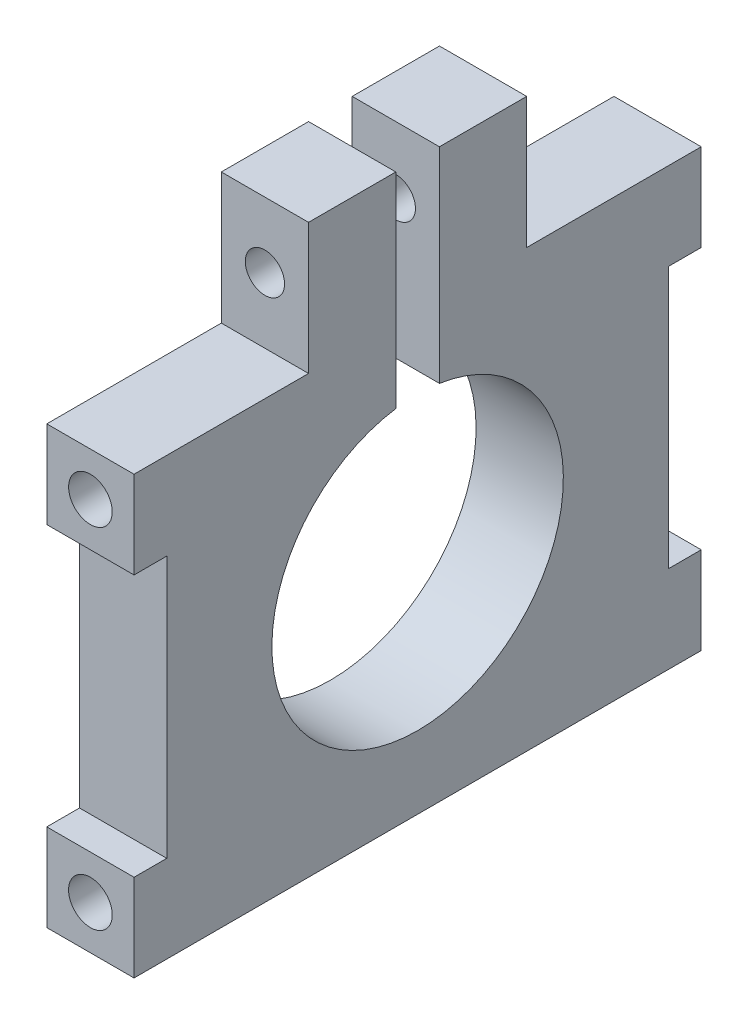
ISO-10303-21;
HEADER;
FILE_DESCRIPTION(('STEP AP214'),'2;1');
FILE_NAME('part.step','',(''),(''),'','','');
FILE_SCHEMA(('AUTOMOTIVE_DESIGN { 1 0 10303 214 1 1 1 1 }'));
ENDSEC;
DATA;
#1=APPLICATION_CONTEXT('core data for automotive mechanical design processes');
#2=APPLICATION_PROTOCOL_DEFINITION('international standard','automotive_design',2000,#1);
#3=PRODUCT_CONTEXT('',#1,'mechanical');
#4=PRODUCT('Part','Part','',(#3));
#5=PRODUCT_RELATED_PRODUCT_CATEGORY('part','',(#4));
#6=PRODUCT_DEFINITION_FORMATION('','',#4);
#7=PRODUCT_DEFINITION_CONTEXT('part definition',#1,'design');
#8=PRODUCT_DEFINITION('design','',#6,#7);
#9=PRODUCT_DEFINITION_SHAPE('','',#8);
#10=(LENGTH_UNIT() NAMED_UNIT(*) SI_UNIT(.MILLI.,.METRE.));
#11=(NAMED_UNIT(*) PLANE_ANGLE_UNIT() SI_UNIT($,.RADIAN.));
#12=(NAMED_UNIT(*) SI_UNIT($,.STERADIAN.) SOLID_ANGLE_UNIT());
#13=UNCERTAINTY_MEASURE_WITH_UNIT(LENGTH_MEASURE(1.E-05),#10,'distance_accuracy_value','');
#14=(GEOMETRIC_REPRESENTATION_CONTEXT(3) GLOBAL_UNCERTAINTY_ASSIGNED_CONTEXT((#13)) GLOBAL_UNIT_ASSIGNED_CONTEXT((#10,
#11,#12)) REPRESENTATION_CONTEXT('',''));
#15=CARTESIAN_POINT('',(0.,0.,0.));
#16=DIRECTION('',(0.,0.,1.));
#17=DIRECTION('',(1.,0.,0.));
#18=AXIS2_PLACEMENT_3D('',#15,#16,#17);
#19=CARTESIAN_POINT('',(5.,25.,32.5));
#20=DIRECTION('',(0.,-1.,0.));
#21=DIRECTION('',(0.,0.,-1.));
#22=AXIS2_PLACEMENT_3D('',#19,#20,#21);
#23=PLANE('',#22);
#24=DIRECTION('',(0.,0.,1.));
#25=VECTOR('',#24,1.);
#26=CARTESIAN_POINT('',(-5.,25.,32.5));
#27=LINE('',#26,#25);
#28=CARTESIAN_POINT('',(-5.,25.,-32.5));
#29=VERTEX_POINT('',#28);
#30=CARTESIAN_POINT('',(-5.,25.,-12.5));
#31=VERTEX_POINT('',#30);
#32=EDGE_CURVE('E61',#29,#31,#27,.T.);
#33=ORIENTED_EDGE('',*,*,#32,.T.);
#34=DIRECTION('',(1.,0.,0.));
#35=VECTOR('',#34,1.);
#36=CARTESIAN_POINT('',(-23.0277563773199,25.,-12.5));
#37=LINE('',#36,#35);
#38=CARTESIAN_POINT('',(5.,25.,-12.5));
#39=VERTEX_POINT('',#38);
#40=EDGE_CURVE('E56',#31,#39,#37,.T.);
#41=ORIENTED_EDGE('',*,*,#40,.T.);
#42=DIRECTION('',(0.,0.,1.));
#43=VECTOR('',#42,1.);
#44=CARTESIAN_POINT('',(5.,25.,32.5));
#45=LINE('',#44,#43);
#46=CARTESIAN_POINT('',(5.,25.,-32.5));
#47=VERTEX_POINT('',#46);
#48=EDGE_CURVE('E288',#47,#39,#45,.T.);
#49=ORIENTED_EDGE('',*,*,#48,.F.);
#50=DIRECTION('',(-1.,0.,0.));
#51=VECTOR('',#50,1.);
#52=CARTESIAN_POINT('',(5.,25.,-32.5));
#53=LINE('',#52,#51);
#54=EDGE_CURVE('E316',#47,#29,#53,.T.);
#55=ORIENTED_EDGE('',*,*,#54,.T.);
#56=EDGE_LOOP('',(#33,#41,#49,#55));
#57=FACE_BOUND('',#56,.T.);
#58=ADVANCED_FACE('F41',(#57),#23,.F.);
#59=CARTESIAN_POINT('',(5.,-25.,-32.5));
#60=DIRECTION('',(0.,0.,1.));
#61=DIRECTION('',(1.,0.,0.));
#62=AXIS2_PLACEMENT_3D('',#59,#60,#61);
#63=PLANE('',#62);
#64=CARTESIAN_POINT('',(0.,-20.,-32.5));
#65=DIRECTION('',(0.,0.,1.));
#66=DIRECTION('',(-1.,0.,0.));
#67=AXIS2_PLACEMENT_3D('',#64,#65,#66);
#68=CIRCLE('',#67,2.5);
#69=CARTESIAN_POINT('',(-2.5,-20.,-32.5));
#70=VERTEX_POINT('',#69);
#71=EDGE_CURVE('E428',#70,#70,#68,.T.);
#72=ORIENTED_EDGE('',*,*,#71,.T.);
#73=EDGE_LOOP('',(#72));
#74=FACE_BOUND('',#73,.T.);
#75=DIRECTION('',(0.,1.,0.));
#76=VECTOR('',#75,1.);
#77=CARTESIAN_POINT('',(-5.,-25.,-32.5));
#78=LINE('',#77,#76);
#79=CARTESIAN_POINT('',(-5.,-25.,-32.5));
#80=VERTEX_POINT('',#79);
#81=CARTESIAN_POINT('',(-5.,-15.,-32.5));
#82=VERTEX_POINT('',#81);
#83=EDGE_CURVE('E297',#80,#82,#78,.T.);
#84=ORIENTED_EDGE('',*,*,#83,.T.);
#85=DIRECTION('',(1.,0.,0.));
#86=VECTOR('',#85,1.);
#87=CARTESIAN_POINT('',(5.,-15.,-32.5));
#88=LINE('',#87,#86);
#89=CARTESIAN_POINT('',(5.,-15.,-32.5));
#90=VERTEX_POINT('',#89);
#91=EDGE_CURVE('E327',#82,#90,#88,.T.);
#92=ORIENTED_EDGE('',*,*,#91,.T.);
#93=DIRECTION('',(0.,1.,0.));
#94=VECTOR('',#93,1.);
#95=CARTESIAN_POINT('',(5.,-25.,-32.5));
#96=LINE('',#95,#94);
#97=CARTESIAN_POINT('',(5.,-25.,-32.5));
#98=VERTEX_POINT('',#97);
#99=EDGE_CURVE('E283',#98,#90,#96,.T.);
#100=ORIENTED_EDGE('',*,*,#99,.F.);
#101=DIRECTION('',(-1.,0.,0.));
#102=VECTOR('',#101,1.);
#103=CARTESIAN_POINT('',(5.,-25.,-32.5));
#104=LINE('',#103,#102);
#105=EDGE_CURVE('E296',#98,#80,#104,.T.);
#106=ORIENTED_EDGE('',*,*,#105,.T.);
#107=EDGE_LOOP('',(#84,#92,#100,#106));
#108=FACE_BOUND('',#107,.T.);
#109=ADVANCED_FACE('F331',(#74,#108),#63,.F.);
#110=CARTESIAN_POINT('',(5.,-25.,32.5));
#111=DIRECTION('',(0.,0.,-1.));
#112=DIRECTION('',(-1.,0.,0.));
#113=AXIS2_PLACEMENT_3D('',#110,#111,#112);
#114=PLANE('',#113);
#115=CARTESIAN_POINT('',(0.,-20.,32.5));
#116=DIRECTION('',(0.,0.,1.));
#117=DIRECTION('',(-1.,0.,0.));
#118=AXIS2_PLACEMENT_3D('',#115,#116,#117);
#119=CIRCLE('',#118,2.5);
#120=CARTESIAN_POINT('',(-2.5,-20.,32.5));
#121=VERTEX_POINT('',#120);
#122=EDGE_CURVE('E419',#121,#121,#119,.T.);
#123=ORIENTED_EDGE('',*,*,#122,.F.);
#124=EDGE_LOOP('',(#123));
#125=FACE_BOUND('',#124,.T.);
#126=DIRECTION('',(0.,-1.,0.));
#127=VECTOR('',#126,1.);
#128=CARTESIAN_POINT('',(5.,-25.,32.5));
#129=LINE('',#128,#127);
#130=CARTESIAN_POINT('',(5.,-15.,32.5));
#131=VERTEX_POINT('',#130);
#132=CARTESIAN_POINT('',(5.,-25.,32.5));
#133=VERTEX_POINT('',#132);
#134=EDGE_CURVE('E290',#131,#133,#129,.T.);
#135=ORIENTED_EDGE('',*,*,#134,.F.);
#136=DIRECTION('',(-1.,0.,0.));
#137=VECTOR('',#136,1.);
#138=CARTESIAN_POINT('',(5.,-15.,32.5));
#139=LINE('',#138,#137);
#140=CARTESIAN_POINT('',(-5.,-15.,32.5));
#141=VERTEX_POINT('',#140);
#142=EDGE_CURVE('E321',#131,#141,#139,.T.);
#143=ORIENTED_EDGE('',*,*,#142,.T.);
#144=DIRECTION('',(0.,-1.,0.));
#145=VECTOR('',#144,1.);
#146=CARTESIAN_POINT('',(-5.,-25.,32.5));
#147=LINE('',#146,#145);
#148=CARTESIAN_POINT('',(-5.,-25.,32.5));
#149=VERTEX_POINT('',#148);
#150=EDGE_CURVE('E302',#141,#149,#147,.T.);
#151=ORIENTED_EDGE('',*,*,#150,.T.);
#152=DIRECTION('',(-1.,0.,0.));
#153=VECTOR('',#152,1.);
#154=CARTESIAN_POINT('',(5.,-25.,32.5));
#155=LINE('',#154,#153);
#156=EDGE_CURVE('E310',#133,#149,#155,.T.);
#157=ORIENTED_EDGE('',*,*,#156,.F.);
#158=EDGE_LOOP('',(#135,#143,#151,#157));
#159=FACE_BOUND('',#158,.T.);
#160=ADVANCED_FACE('F393',(#125,#159),#114,.F.);
#161=CARTESIAN_POINT('',(5.,0.,0.));
#162=DIRECTION('',(-1.,0.,0.));
#163=DIRECTION('',(0.,0.,1.));
#164=AXIS2_PLACEMENT_3D('',#161,#162,#163);
#165=PLANE('',#164);
#166=ORIENTED_EDGE('',*,*,#48,.T.);
#167=DIRECTION('',(0.,1.,0.));
#168=VECTOR('',#167,1.);
#169=CARTESIAN_POINT('',(5.,40.,-12.5));
#170=LINE('',#169,#168);
#171=CARTESIAN_POINT('',(5.,40.,-12.5));
#172=VERTEX_POINT('',#171);
#173=EDGE_CURVE('E217',#39,#172,#170,.T.);
#174=ORIENTED_EDGE('',*,*,#173,.T.);
#175=DIRECTION('',(0.,0.,1.));
#176=VECTOR('',#175,1.);
#177=CARTESIAN_POINT('',(5.,40.,-2.5));
#178=LINE('',#177,#176);
#179=CARTESIAN_POINT('',(5.,40.,-2.5));
#180=VERTEX_POINT('',#179);
#181=EDGE_CURVE('E225',#172,#180,#178,.T.);
#182=ORIENTED_EDGE('',*,*,#181,.T.);
#183=DIRECTION('',(0.,1.,0.));
#184=VECTOR('',#183,1.);
#185=CARTESIAN_POINT('',(5.,13.35025,-2.5));
#186=LINE('',#185,#184);
#187=CARTESIAN_POINT('',(5.,16.5123196507941,-2.5));
#188=VERTEX_POINT('',#187);
#189=EDGE_CURVE('E232',#188,#180,#186,.T.);
#190=ORIENTED_EDGE('',*,*,#189,.F.);
#191=CARTESIAN_POINT('',(5.,0.,0.));
#192=DIRECTION('',(1.,0.,0.));
#193=DIRECTION('',(0.,0.,-1.));
#194=AXIS2_PLACEMENT_3D('',#191,#192,#193);
#195=CIRCLE('',#194,16.7005);
#196=CARTESIAN_POINT('',(5.,16.5123196507941,2.5));
#197=VERTEX_POINT('',#196);
#198=EDGE_CURVE('E278',#197,#188,#195,.T.);
#199=ORIENTED_EDGE('',*,*,#198,.F.);
#200=DIRECTION('',(0.,-1.,0.));
#201=VECTOR('',#200,1.);
#202=CARTESIAN_POINT('',(5.,13.35025,2.5));
#203=LINE('',#202,#201);
#204=CARTESIAN_POINT('',(5.,40.,2.5));
#205=VERTEX_POINT('',#204);
#206=EDGE_CURVE('E230',#205,#197,#203,.T.);
#207=ORIENTED_EDGE('',*,*,#206,.F.);
#208=DIRECTION('',(0.,0.,1.));
#209=VECTOR('',#208,1.);
#210=CARTESIAN_POINT('',(5.,40.,2.5));
#211=LINE('',#210,#209);
#212=CARTESIAN_POINT('',(5.,40.,12.5));
#213=VERTEX_POINT('',#212);
#214=EDGE_CURVE('E203',#205,#213,#211,.T.);
#215=ORIENTED_EDGE('',*,*,#214,.T.);
#216=DIRECTION('',(0.,-1.,0.));
#217=VECTOR('',#216,1.);
#218=CARTESIAN_POINT('',(5.,40.,12.5));
#219=LINE('',#218,#217);
#220=CARTESIAN_POINT('',(5.,25.,12.5));
#221=VERTEX_POINT('',#220);
#222=EDGE_CURVE('E204',#213,#221,#219,.T.);
#223=ORIENTED_EDGE('',*,*,#222,.T.);
#224=CARTESIAN_POINT('',(5.,25.,32.5));
#225=VERTEX_POINT('',#224);
#226=EDGE_CURVE('E286',#221,#225,#45,.T.);
#227=ORIENTED_EDGE('',*,*,#226,.T.);
#228=CARTESIAN_POINT('',(5.,15.,32.5));
#229=VERTEX_POINT('',#228);
#230=EDGE_CURVE('E291',#225,#229,#129,.T.);
#231=ORIENTED_EDGE('',*,*,#230,.T.);
#232=DIRECTION('',(0.,0.,1.));
#233=VECTOR('',#232,1.);
#234=CARTESIAN_POINT('',(5.,15.,36.25));
#235=LINE('',#234,#233);
#236=CARTESIAN_POINT('',(5.,15.,28.75));
#237=VERTEX_POINT('',#236);
#238=EDGE_CURVE('E250',#237,#229,#235,.T.);
#239=ORIENTED_EDGE('',*,*,#238,.F.);
#240=DIRECTION('',(0.,1.,0.));
#241=VECTOR('',#240,1.);
#242=CARTESIAN_POINT('',(5.,-15.,28.75));
#243=LINE('',#242,#241);
#244=CARTESIAN_POINT('',(5.,-15.,28.75));
#245=VERTEX_POINT('',#244);
#246=EDGE_CURVE('E247',#245,#237,#243,.T.);
#247=ORIENTED_EDGE('',*,*,#246,.F.);
#248=DIRECTION('',(0.,0.,-1.));
#249=VECTOR('',#248,1.);
#250=CARTESIAN_POINT('',(5.,-15.,36.25));
#251=LINE('',#250,#249);
#252=EDGE_CURVE('E240',#131,#245,#251,.T.);
#253=ORIENTED_EDGE('',*,*,#252,.F.);
#254=ORIENTED_EDGE('',*,*,#134,.T.);
#255=DIRECTION('',(0.,0.,-1.));
#256=VECTOR('',#255,1.);
#257=CARTESIAN_POINT('',(5.,-25.,32.5));
#258=LINE('',#257,#256);
#259=EDGE_CURVE('E294',#133,#98,#258,.T.);
#260=ORIENTED_EDGE('',*,*,#259,.T.);
#261=ORIENTED_EDGE('',*,*,#99,.T.);
#262=DIRECTION('',(0.,0.,-1.));
#263=VECTOR('',#262,1.);
#264=CARTESIAN_POINT('',(5.,-15.,-36.25));
#265=LINE('',#264,#263);
#266=CARTESIAN_POINT('',(5.,-15.,-28.75));
#267=VERTEX_POINT('',#266);
#268=EDGE_CURVE('E264',#267,#90,#265,.T.);
#269=ORIENTED_EDGE('',*,*,#268,.F.);
#270=DIRECTION('',(0.,-1.,0.));
#271=VECTOR('',#270,1.);
#272=CARTESIAN_POINT('',(5.,-15.,-28.75));
#273=LINE('',#272,#271);
#274=CARTESIAN_POINT('',(5.,15.,-28.75));
#275=VERTEX_POINT('',#274);
#276=EDGE_CURVE('E266',#275,#267,#273,.T.);
#277=ORIENTED_EDGE('',*,*,#276,.F.);
#278=DIRECTION('',(0.,0.,1.));
#279=VECTOR('',#278,1.);
#280=CARTESIAN_POINT('',(5.,15.,-36.25));
#281=LINE('',#280,#279);
#282=CARTESIAN_POINT('',(5.,15.,-32.5));
#283=VERTEX_POINT('',#282);
#284=EDGE_CURVE('E251',#283,#275,#281,.T.);
#285=ORIENTED_EDGE('',*,*,#284,.F.);
#286=EDGE_CURVE('E287',#283,#47,#96,.T.);
#287=ORIENTED_EDGE('',*,*,#286,.T.);
#288=EDGE_LOOP('',(#166,#174,#182,#190,#199,#207,#215,#223,#227,#231,#239,#247,#253,#254,#260,
#261,#269,#277,#285,#287));
#289=FACE_BOUND('',#288,.T.);
#290=ADVANCED_FACE('F337',(#289),#165,.F.);
#291=CARTESIAN_POINT('',(-5.,0.,0.));
#292=DIRECTION('',(-1.,0.,0.));
#293=DIRECTION('',(0.,0.,1.));
#294=AXIS2_PLACEMENT_3D('',#291,#292,#293);
#295=PLANE('',#294);
#296=DIRECTION('',(0.,1.,0.));
#297=VECTOR('',#296,1.);
#298=CARTESIAN_POINT('',(-5.,13.35025,-2.5));
#299=LINE('',#298,#297);
#300=CARTESIAN_POINT('',(-5.,16.5123196507941,-2.5));
#301=VERTEX_POINT('',#300);
#302=CARTESIAN_POINT('',(-5.,40.,-2.5));
#303=VERTEX_POINT('',#302);
#304=EDGE_CURVE('E189',#301,#303,#299,.T.);
#305=ORIENTED_EDGE('',*,*,#304,.T.);
#306=DIRECTION('',(0.,0.,1.));
#307=VECTOR('',#306,1.);
#308=CARTESIAN_POINT('',(-5.,40.,-2.5));
#309=LINE('',#308,#307);
#310=CARTESIAN_POINT('',(-5.,40.,-12.5));
#311=VERTEX_POINT('',#310);
#312=EDGE_CURVE('E214',#311,#303,#309,.T.);
#313=ORIENTED_EDGE('',*,*,#312,.F.);
#314=DIRECTION('',(0.,1.,0.));
#315=VECTOR('',#314,1.);
#316=CARTESIAN_POINT('',(-5.,40.,-12.5));
#317=LINE('',#316,#315);
#318=EDGE_CURVE('E218',#31,#311,#317,.T.);
#319=ORIENTED_EDGE('',*,*,#318,.F.);
#320=ORIENTED_EDGE('',*,*,#32,.F.);
#321=CARTESIAN_POINT('',(-5.,15.,-32.5));
#322=VERTEX_POINT('',#321);
#323=EDGE_CURVE('E281',#322,#29,#78,.T.);
#324=ORIENTED_EDGE('',*,*,#323,.F.);
#325=DIRECTION('',(0.,0.,1.));
#326=VECTOR('',#325,1.);
#327=CARTESIAN_POINT('',(-5.,15.,-36.25));
#328=LINE('',#327,#326);
#329=CARTESIAN_POINT('',(-5.,15.,-28.75));
#330=VERTEX_POINT('',#329);
#331=EDGE_CURVE('E267',#322,#330,#328,.T.);
#332=ORIENTED_EDGE('',*,*,#331,.T.);
#333=DIRECTION('',(0.,-1.,0.));
#334=VECTOR('',#333,1.);
#335=CARTESIAN_POINT('',(-5.,-15.,-28.75));
#336=LINE('',#335,#334);
#337=CARTESIAN_POINT('',(-5.,-15.,-28.75));
#338=VERTEX_POINT('',#337);
#339=EDGE_CURVE('E273',#330,#338,#336,.T.);
#340=ORIENTED_EDGE('',*,*,#339,.T.);
#341=DIRECTION('',(0.,0.,-1.));
#342=VECTOR('',#341,1.);
#343=CARTESIAN_POINT('',(-5.,-15.,-36.25));
#344=LINE('',#343,#342);
#345=EDGE_CURVE('E262',#338,#82,#344,.T.);
#346=ORIENTED_EDGE('',*,*,#345,.T.);
#347=ORIENTED_EDGE('',*,*,#83,.F.);
#348=DIRECTION('',(0.,0.,-1.));
#349=VECTOR('',#348,1.);
#350=CARTESIAN_POINT('',(-5.,-25.,32.5));
#351=LINE('',#350,#349);
#352=EDGE_CURVE('E306',#149,#80,#351,.T.);
#353=ORIENTED_EDGE('',*,*,#352,.F.);
#354=ORIENTED_EDGE('',*,*,#150,.F.);
#355=DIRECTION('',(0.,0.,-1.));
#356=VECTOR('',#355,1.);
#357=CARTESIAN_POINT('',(-5.,-15.,36.25));
#358=LINE('',#357,#356);
#359=CARTESIAN_POINT('',(-5.,-15.,28.75));
#360=VERTEX_POINT('',#359);
#361=EDGE_CURVE('E243',#141,#360,#358,.T.);
#362=ORIENTED_EDGE('',*,*,#361,.T.);
#363=DIRECTION('',(0.,1.,0.));
#364=VECTOR('',#363,1.);
#365=CARTESIAN_POINT('',(-5.,-15.,28.75));
#366=LINE('',#365,#364);
#367=CARTESIAN_POINT('',(-5.,15.,28.75));
#368=VERTEX_POINT('',#367);
#369=EDGE_CURVE('E236',#360,#368,#366,.T.);
#370=ORIENTED_EDGE('',*,*,#369,.T.);
#371=DIRECTION('',(0.,0.,1.));
#372=VECTOR('',#371,1.);
#373=CARTESIAN_POINT('',(-5.,15.,36.25));
#374=LINE('',#373,#372);
#375=CARTESIAN_POINT('',(-5.,15.,32.5));
#376=VERTEX_POINT('',#375);
#377=EDGE_CURVE('E239',#368,#376,#374,.T.);
#378=ORIENTED_EDGE('',*,*,#377,.T.);
#379=CARTESIAN_POINT('',(-5.,25.,32.5));
#380=VERTEX_POINT('',#379);
#381=EDGE_CURVE('E303',#380,#376,#147,.T.);
#382=ORIENTED_EDGE('',*,*,#381,.F.);
#383=CARTESIAN_POINT('',(-5.,25.,12.5));
#384=VERTEX_POINT('',#383);
#385=EDGE_CURVE('E300',#384,#380,#27,.T.);
#386=ORIENTED_EDGE('',*,*,#385,.F.);
#387=DIRECTION('',(0.,-1.,0.));
#388=VECTOR('',#387,1.);
#389=CARTESIAN_POINT('',(-5.,40.,12.5));
#390=LINE('',#389,#388);
#391=CARTESIAN_POINT('',(-5.,40.,12.5));
#392=VERTEX_POINT('',#391);
#393=EDGE_CURVE('E196',#392,#384,#390,.T.);
#394=ORIENTED_EDGE('',*,*,#393,.F.);
#395=DIRECTION('',(0.,0.,1.));
#396=VECTOR('',#395,1.);
#397=CARTESIAN_POINT('',(-5.,40.,2.5));
#398=LINE('',#397,#396);
#399=CARTESIAN_POINT('',(-5.,40.,2.5));
#400=VERTEX_POINT('',#399);
#401=EDGE_CURVE('E192',#400,#392,#398,.T.);
#402=ORIENTED_EDGE('',*,*,#401,.F.);
#403=DIRECTION('',(0.,-1.,0.));
#404=VECTOR('',#403,1.);
#405=CARTESIAN_POINT('',(-5.,13.35025,2.5));
#406=LINE('',#405,#404);
#407=CARTESIAN_POINT('',(-5.,16.5123196507941,2.5));
#408=VERTEX_POINT('',#407);
#409=EDGE_CURVE('E178',#400,#408,#406,.T.);
#410=ORIENTED_EDGE('',*,*,#409,.T.);
#411=CARTESIAN_POINT('',(-5.,0.,0.));
#412=DIRECTION('',(1.,0.,0.));
#413=DIRECTION('',(0.,0.,-1.));
#414=AXIS2_PLACEMENT_3D('',#411,#412,#413);
#415=CIRCLE('',#414,16.7005);
#416=EDGE_CURVE('E257',#408,#301,#415,.T.);
#417=ORIENTED_EDGE('',*,*,#416,.T.);
#418=EDGE_LOOP('',(#305,#313,#319,#320,#324,#332,#340,#346,#347,#353,#354,#362,#370,#378,#382,
#386,#394,#402,#410,#417));
#419=FACE_BOUND('',#418,.T.);
#420=ADVANCED_FACE('F193',(#419),#295,.T.);
#421=CARTESIAN_POINT('',(0.,20.,-32.5));
#422=DIRECTION('',(0.,0.,1.));
#423=DIRECTION('',(1.,0.,0.));
#424=AXIS2_PLACEMENT_3D('',#421,#422,#423);
#425=CIRCLE('',#424,2.5);
#426=CARTESIAN_POINT('',(2.5,20.,-32.5));
#427=VERTEX_POINT('',#426);
#428=EDGE_CURVE('E435',#427,#427,#425,.T.);
#429=ORIENTED_EDGE('',*,*,#428,.T.);
#430=EDGE_LOOP('',(#429));
#431=FACE_BOUND('',#430,.T.);
#432=ORIENTED_EDGE('',*,*,#286,.F.);
#433=DIRECTION('',(-1.,0.,0.));
#434=VECTOR('',#433,1.);
#435=CARTESIAN_POINT('',(5.,15.,-32.5));
#436=LINE('',#435,#434);
#437=EDGE_CURVE('E324',#283,#322,#436,.T.);
#438=ORIENTED_EDGE('',*,*,#437,.T.);
#439=ORIENTED_EDGE('',*,*,#323,.T.);
#440=ORIENTED_EDGE('',*,*,#54,.F.);
#441=EDGE_LOOP('',(#432,#438,#439,#440));
#442=FACE_BOUND('',#441,.T.);
#443=ADVANCED_FACE('F43',(#431,#442),#63,.F.);
#444=ORIENTED_EDGE('',*,*,#226,.F.);
#445=DIRECTION('',(1.,0.,0.));
#446=VECTOR('',#445,1.);
#447=CARTESIAN_POINT('',(-23.0277563773199,25.,12.5));
#448=LINE('',#447,#446);
#449=EDGE_CURVE('E234',#384,#221,#448,.T.);
#450=ORIENTED_EDGE('',*,*,#449,.F.);
#451=ORIENTED_EDGE('',*,*,#385,.T.);
#452=DIRECTION('',(-1.,0.,0.));
#453=VECTOR('',#452,1.);
#454=CARTESIAN_POINT('',(5.,25.,32.5));
#455=LINE('',#454,#453);
#456=EDGE_CURVE('E313',#225,#380,#455,.T.);
#457=ORIENTED_EDGE('',*,*,#456,.F.);
#458=EDGE_LOOP('',(#444,#450,#451,#457));
#459=FACE_BOUND('',#458,.T.);
#460=ADVANCED_FACE('F387',(#459),#23,.F.);
#461=CARTESIAN_POINT('',(0.,20.,32.5));
#462=DIRECTION('',(0.,0.,1.));
#463=DIRECTION('',(1.,0.,0.));
#464=AXIS2_PLACEMENT_3D('',#461,#462,#463);
#465=CIRCLE('',#464,2.5);
#466=CARTESIAN_POINT('',(2.5,20.,32.5));
#467=VERTEX_POINT('',#466);
#468=EDGE_CURVE('E423',#467,#467,#465,.T.);
#469=ORIENTED_EDGE('',*,*,#468,.F.);
#470=EDGE_LOOP('',(#469));
#471=FACE_BOUND('',#470,.T.);
#472=ORIENTED_EDGE('',*,*,#381,.T.);
#473=DIRECTION('',(1.,0.,0.));
#474=VECTOR('',#473,1.);
#475=CARTESIAN_POINT('',(5.,15.,32.5));
#476=LINE('',#475,#474);
#477=EDGE_CURVE('E318',#376,#229,#476,.T.);
#478=ORIENTED_EDGE('',*,*,#477,.T.);
#479=ORIENTED_EDGE('',*,*,#230,.F.);
#480=ORIENTED_EDGE('',*,*,#456,.T.);
#481=EDGE_LOOP('',(#472,#478,#479,#480));
#482=FACE_BOUND('',#481,.T.);
#483=ADVANCED_FACE('F397',(#471,#482),#114,.F.);
#484=CARTESIAN_POINT('',(5.,-25.,32.5));
#485=DIRECTION('',(0.,1.,0.));
#486=DIRECTION('',(0.,0.,1.));
#487=AXIS2_PLACEMENT_3D('',#484,#485,#486);
#488=PLANE('',#487);
#489=ORIENTED_EDGE('',*,*,#352,.T.);
#490=ORIENTED_EDGE('',*,*,#105,.F.);
#491=ORIENTED_EDGE('',*,*,#259,.F.);
#492=ORIENTED_EDGE('',*,*,#156,.T.);
#493=EDGE_LOOP('',(#489,#490,#491,#492));
#494=FACE_BOUND('',#493,.T.);
#495=ADVANCED_FACE('F345',(#494),#488,.F.);
#496=CARTESIAN_POINT('',(5.,0.,0.));
#497=DIRECTION('',(-1.,0.,0.));
#498=DIRECTION('',(0.,0.,1.));
#499=AXIS2_PLACEMENT_3D('',#496,#497,#498);
#500=CYLINDRICAL_SURFACE('',#499,16.7005);
#501=DIRECTION('',(-1.,0.,0.));
#502=VECTOR('',#501,1.);
#503=CARTESIAN_POINT('',(5.,16.5123196507941,-2.5));
#504=LINE('',#503,#502);
#505=EDGE_CURVE('E11',#301,#188,#504,.F.);
#506=ORIENTED_EDGE('',*,*,#505,.F.);
#507=ORIENTED_EDGE('',*,*,#416,.F.);
#508=DIRECTION('',(-1.,0.,0.));
#509=VECTOR('',#508,1.);
#510=CARTESIAN_POINT('',(5.,16.5123196507941,2.5));
#511=LINE('',#510,#509);
#512=EDGE_CURVE('E49',#197,#408,#511,.T.);
#513=ORIENTED_EDGE('',*,*,#512,.F.);
#514=ORIENTED_EDGE('',*,*,#198,.T.);
#515=EDGE_LOOP('',(#506,#507,#513,#514));
#516=FACE_BOUND('',#515,.T.);
#517=ADVANCED_FACE('F371',(#516),#500,.F.);
#518=CARTESIAN_POINT('',(-5.,-15.,36.25));
#519=DIRECTION('',(0.,-1.,0.));
#520=DIRECTION('',(0.,0.,-1.));
#521=AXIS2_PLACEMENT_3D('',#518,#519,#520);
#522=PLANE('',#521);
#523=ORIENTED_EDGE('',*,*,#252,.T.);
#524=DIRECTION('',(1.,0.,0.));
#525=VECTOR('',#524,1.);
#526=CARTESIAN_POINT('',(-5.,-15.,28.75));
#527=LINE('',#526,#525);
#528=EDGE_CURVE('E254',#360,#245,#527,.T.);
#529=ORIENTED_EDGE('',*,*,#528,.F.);
#530=ORIENTED_EDGE('',*,*,#361,.F.);
#531=ORIENTED_EDGE('',*,*,#142,.F.);
#532=EDGE_LOOP('',(#523,#529,#530,#531));
#533=FACE_BOUND('',#532,.T.);
#534=ADVANCED_FACE('F668',(#533),#522,.F.);
#535=CARTESIAN_POINT('',(-5.,15.,36.25));
#536=DIRECTION('',(0.,1.,0.));
#537=DIRECTION('',(0.,0.,1.));
#538=AXIS2_PLACEMENT_3D('',#535,#536,#537);
#539=PLANE('',#538);
#540=ORIENTED_EDGE('',*,*,#377,.F.);
#541=DIRECTION('',(1.,0.,0.));
#542=VECTOR('',#541,1.);
#543=CARTESIAN_POINT('',(-5.,15.,28.75));
#544=LINE('',#543,#542);
#545=EDGE_CURVE('E246',#368,#237,#544,.T.);
#546=ORIENTED_EDGE('',*,*,#545,.T.);
#547=ORIENTED_EDGE('',*,*,#238,.T.);
#548=ORIENTED_EDGE('',*,*,#477,.F.);
#549=EDGE_LOOP('',(#540,#546,#547,#548));
#550=FACE_BOUND('',#549,.T.);
#551=ADVANCED_FACE('F660',(#550),#539,.F.);
#552=CARTESIAN_POINT('',(-5.,-15.,28.75));
#553=DIRECTION('',(0.,0.,-1.));
#554=DIRECTION('',(-1.,0.,0.));
#555=AXIS2_PLACEMENT_3D('',#552,#553,#554);
#556=PLANE('',#555);
#557=ORIENTED_EDGE('',*,*,#246,.T.);
#558=ORIENTED_EDGE('',*,*,#545,.F.);
#559=ORIENTED_EDGE('',*,*,#369,.F.);
#560=ORIENTED_EDGE('',*,*,#528,.T.);
#561=EDGE_LOOP('',(#557,#558,#559,#560));
#562=FACE_BOUND('',#561,.T.);
#563=ADVANCED_FACE('F652',(#562),#556,.F.);
#564=CARTESIAN_POINT('',(-5.,-15.,-36.25));
#565=DIRECTION('',(0.,-1.,0.));
#566=DIRECTION('',(0.,0.,-1.));
#567=AXIS2_PLACEMENT_3D('',#564,#565,#566);
#568=PLANE('',#567);
#569=ORIENTED_EDGE('',*,*,#345,.F.);
#570=DIRECTION('',(1.,0.,0.));
#571=VECTOR('',#570,1.);
#572=CARTESIAN_POINT('',(-5.,-15.,-28.75));
#573=LINE('',#572,#571);
#574=EDGE_CURVE('E188',#338,#267,#573,.T.);
#575=ORIENTED_EDGE('',*,*,#574,.T.);
#576=ORIENTED_EDGE('',*,*,#268,.T.);
#577=ORIENTED_EDGE('',*,*,#91,.F.);
#578=EDGE_LOOP('',(#569,#575,#576,#577));
#579=FACE_BOUND('',#578,.T.);
#580=ADVANCED_FACE('F349',(#579),#568,.F.);
#581=CARTESIAN_POINT('',(-5.,15.,-36.25));
#582=DIRECTION('',(0.,1.,0.));
#583=DIRECTION('',(0.,0.,1.));
#584=AXIS2_PLACEMENT_3D('',#581,#582,#583);
#585=PLANE('',#584);
#586=ORIENTED_EDGE('',*,*,#284,.T.);
#587=DIRECTION('',(1.,0.,0.));
#588=VECTOR('',#587,1.);
#589=CARTESIAN_POINT('',(-5.,15.,-28.75));
#590=LINE('',#589,#588);
#591=EDGE_CURVE('E259',#330,#275,#590,.T.);
#592=ORIENTED_EDGE('',*,*,#591,.F.);
#593=ORIENTED_EDGE('',*,*,#331,.F.);
#594=ORIENTED_EDGE('',*,*,#437,.F.);
#595=EDGE_LOOP('',(#586,#592,#593,#594));
#596=FACE_BOUND('',#595,.T.);
#597=ADVANCED_FACE('F637',(#596),#585,.F.);
#598=CARTESIAN_POINT('',(-5.,-15.,-28.75));
#599=DIRECTION('',(0.,0.,1.));
#600=DIRECTION('',(1.,0.,0.));
#601=AXIS2_PLACEMENT_3D('',#598,#599,#600);
#602=PLANE('',#601);
#603=ORIENTED_EDGE('',*,*,#276,.T.);
#604=ORIENTED_EDGE('',*,*,#574,.F.);
#605=ORIENTED_EDGE('',*,*,#339,.F.);
#606=ORIENTED_EDGE('',*,*,#591,.T.);
#607=EDGE_LOOP('',(#603,#604,#605,#606));
#608=FACE_BOUND('',#607,.T.);
#609=ADVANCED_FACE('F351',(#608),#602,.F.);
#610=CARTESIAN_POINT('',(-5.,13.35025,2.5));
#611=DIRECTION('',(0.,0.,1.));
#612=DIRECTION('',(1.,0.,0.));
#613=AXIS2_PLACEMENT_3D('',#610,#611,#612);
#614=PLANE('',#613);
#615=CARTESIAN_POINT('',(0.,32.5,2.5));
#616=DIRECTION('',(0.,0.,1.));
#617=DIRECTION('',(1.,0.,0.));
#618=AXIS2_PLACEMENT_3D('',#615,#616,#617);
#619=CIRCLE('',#618,2.25);
#620=CARTESIAN_POINT('',(2.25,32.5,2.5));
#621=VERTEX_POINT('',#620);
#622=EDGE_CURVE('E432',#621,#621,#619,.T.);
#623=ORIENTED_EDGE('',*,*,#622,.T.);
#624=EDGE_LOOP('',(#623));
#625=FACE_BOUND('',#624,.T.);
#626=ORIENTED_EDGE('',*,*,#206,.T.);
#627=ORIENTED_EDGE('',*,*,#512,.T.);
#628=ORIENTED_EDGE('',*,*,#409,.F.);
#629=DIRECTION('',(1.,0.,0.));
#630=VECTOR('',#629,1.);
#631=CARTESIAN_POINT('',(-23.0277563773199,40.,2.5));
#632=LINE('',#631,#630);
#633=EDGE_CURVE('E182',#400,#205,#632,.T.);
#634=ORIENTED_EDGE('',*,*,#633,.T.);
#635=EDGE_LOOP('',(#626,#627,#628,#634));
#636=FACE_BOUND('',#635,.T.);
#637=ADVANCED_FACE('F180',(#625,#636),#614,.F.);
#638=CARTESIAN_POINT('',(-5.,13.35025,-2.5));
#639=DIRECTION('',(0.,0.,-1.));
#640=DIRECTION('',(-1.,0.,0.));
#641=AXIS2_PLACEMENT_3D('',#638,#639,#640);
#642=PLANE('',#641);
#643=CARTESIAN_POINT('',(0.,32.5,-2.5));
#644=DIRECTION('',(0.,0.,-1.));
#645=DIRECTION('',(-1.,0.,0.));
#646=AXIS2_PLACEMENT_3D('',#643,#644,#645);
#647=CIRCLE('',#646,2.25);
#648=CARTESIAN_POINT('',(-2.25,32.5,-2.5));
#649=VERTEX_POINT('',#648);
#650=EDGE_CURVE('E442',#649,#649,#647,.T.);
#651=ORIENTED_EDGE('',*,*,#650,.T.);
#652=EDGE_LOOP('',(#651));
#653=FACE_BOUND('',#652,.T.);
#654=ORIENTED_EDGE('',*,*,#304,.F.);
#655=ORIENTED_EDGE('',*,*,#505,.T.);
#656=ORIENTED_EDGE('',*,*,#189,.T.);
#657=DIRECTION('',(1.,0.,0.));
#658=VECTOR('',#657,1.);
#659=CARTESIAN_POINT('',(-23.0277563773199,40.,-2.5));
#660=LINE('',#659,#658);
#661=EDGE_CURVE('E211',#303,#180,#660,.T.);
#662=ORIENTED_EDGE('',*,*,#661,.F.);
#663=EDGE_LOOP('',(#654,#655,#656,#662));
#664=FACE_BOUND('',#663,.T.);
#665=ADVANCED_FACE('F372',(#653,#664),#642,.F.);
#666=CARTESIAN_POINT('',(-23.0277563773199,40.,-12.5));
#667=DIRECTION('',(0.,0.,-1.));
#668=DIRECTION('',(0.,1.,0.));
#669=AXIS2_PLACEMENT_3D('',#666,#667,#668);
#670=PLANE('',#669);
#671=CARTESIAN_POINT('',(0.,32.5,-12.5));
#672=DIRECTION('',(0.,0.,-1.));
#673=DIRECTION('',(0.,1.,0.));
#674=AXIS2_PLACEMENT_3D('',#671,#672,#673);
#675=CIRCLE('',#674,2.25);
#676=CARTESIAN_POINT('',(0.,34.75,-12.5));
#677=VERTEX_POINT('',#676);
#678=EDGE_CURVE('E444',#677,#677,#675,.F.);
#679=ORIENTED_EDGE('',*,*,#678,.T.);
#680=EDGE_LOOP('',(#679));
#681=FACE_BOUND('',#680,.T.);
#682=ORIENTED_EDGE('',*,*,#40,.F.);
#683=ORIENTED_EDGE('',*,*,#318,.T.);
#684=DIRECTION('',(1.,0.,0.));
#685=VECTOR('',#684,1.);
#686=CARTESIAN_POINT('',(-23.0277563773199,40.,-12.5));
#687=LINE('',#686,#685);
#688=EDGE_CURVE('E219',#311,#172,#687,.T.);
#689=ORIENTED_EDGE('',*,*,#688,.T.);
#690=ORIENTED_EDGE('',*,*,#173,.F.);
#691=EDGE_LOOP('',(#682,#683,#689,#690));
#692=FACE_BOUND('',#691,.T.);
#693=ADVANCED_FACE('F360',(#681,#692),#670,.T.);
#694=CARTESIAN_POINT('',(-23.0277563773199,40.,-2.5));
#695=DIRECTION('',(0.,1.,0.));
#696=DIRECTION('',(0.,0.,1.));
#697=AXIS2_PLACEMENT_3D('',#694,#695,#696);
#698=PLANE('',#697);
#699=ORIENTED_EDGE('',*,*,#688,.F.);
#700=ORIENTED_EDGE('',*,*,#312,.T.);
#701=ORIENTED_EDGE('',*,*,#661,.T.);
#702=ORIENTED_EDGE('',*,*,#181,.F.);
#703=EDGE_LOOP('',(#699,#700,#701,#702));
#704=FACE_BOUND('',#703,.T.);
#705=ADVANCED_FACE('F364',(#704),#698,.T.);
#706=CARTESIAN_POINT('',(-23.0277563773199,40.,2.5));
#707=DIRECTION('',(0.,1.,0.));
#708=DIRECTION('',(0.,0.,1.));
#709=AXIS2_PLACEMENT_3D('',#706,#707,#708);
#710=PLANE('',#709);
#711=ORIENTED_EDGE('',*,*,#633,.F.);
#712=ORIENTED_EDGE('',*,*,#401,.T.);
#713=DIRECTION('',(1.,0.,0.));
#714=VECTOR('',#713,1.);
#715=CARTESIAN_POINT('',(-23.0277563773199,40.,12.5));
#716=LINE('',#715,#714);
#717=EDGE_CURVE('E199',#392,#213,#716,.T.);
#718=ORIENTED_EDGE('',*,*,#717,.T.);
#719=ORIENTED_EDGE('',*,*,#214,.F.);
#720=EDGE_LOOP('',(#711,#712,#718,#719));
#721=FACE_BOUND('',#720,.T.);
#722=ADVANCED_FACE('F201',(#721),#710,.T.);
#723=CARTESIAN_POINT('',(-23.0277563773199,40.,12.5));
#724=DIRECTION('',(0.,0.,1.));
#725=DIRECTION('',(0.,-1.,0.));
#726=AXIS2_PLACEMENT_3D('',#723,#724,#725);
#727=PLANE('',#726);
#728=CARTESIAN_POINT('',(0.,32.5,12.5));
#729=DIRECTION('',(0.,0.,1.));
#730=DIRECTION('',(1.,0.,0.));
#731=AXIS2_PLACEMENT_3D('',#728,#729,#730);
#732=CIRCLE('',#731,2.25);
#733=CARTESIAN_POINT('',(2.25,32.5,12.5));
#734=VERTEX_POINT('',#733);
#735=EDGE_CURVE('E447',#734,#734,#732,.T.);
#736=ORIENTED_EDGE('',*,*,#735,.F.);
#737=EDGE_LOOP('',(#736));
#738=FACE_BOUND('',#737,.T.);
#739=ORIENTED_EDGE('',*,*,#717,.F.);
#740=ORIENTED_EDGE('',*,*,#393,.T.);
#741=ORIENTED_EDGE('',*,*,#449,.T.);
#742=ORIENTED_EDGE('',*,*,#222,.F.);
#743=EDGE_LOOP('',(#739,#740,#741,#742));
#744=FACE_BOUND('',#743,.T.);
#745=ADVANCED_FACE('F412',(#738,#744),#727,.T.);
#746=CARTESIAN_POINT('',(0.,20.,22.5));
#747=DIRECTION('',(0.,0.,1.));
#748=DIRECTION('',(1.,0.,0.));
#749=AXIS2_PLACEMENT_3D('',#746,#747,#748);
#750=CYLINDRICAL_SURFACE('',#749,2.5);
#751=CARTESIAN_POINT('',(0.,20.,22.5));
#752=DIRECTION('',(0.,0.,1.));
#753=DIRECTION('',(1.,0.,0.));
#754=AXIS2_PLACEMENT_3D('',#751,#752,#753);
#755=CIRCLE('',#754,2.5);
#756=CARTESIAN_POINT('',(2.5,20.,22.5));
#757=VERTEX_POINT('',#756);
#758=EDGE_CURVE('E215',#757,#757,#755,.T.);
#759=ORIENTED_EDGE('',*,*,#758,.F.);
#760=EDGE_LOOP('',(#759));
#761=FACE_BOUND('',#760,.T.);
#762=ORIENTED_EDGE('',*,*,#468,.T.);
#763=EDGE_LOOP('',(#762));
#764=FACE_BOUND('',#763,.T.);
#765=ADVANCED_FACE('F455',(#761,#764),#750,.F.);
#766=CARTESIAN_POINT('',(0.,20.,22.5));
#767=DIRECTION('',(0.,0.,1.));
#768=DIRECTION('',(1.,0.,0.));
#769=AXIS2_PLACEMENT_3D('',#766,#767,#768);
#770=PLANE('',#769);
#771=ORIENTED_EDGE('',*,*,#758,.T.);
#772=EDGE_LOOP('',(#771));
#773=FACE_BOUND('',#772,.T.);
#774=ADVANCED_FACE('F461',(#773),#770,.T.);
#775=CARTESIAN_POINT('',(0.,-20.,22.5));
#776=DIRECTION('',(0.,0.,1.));
#777=DIRECTION('',(1.,0.,0.));
#778=AXIS2_PLACEMENT_3D('',#775,#776,#777);
#779=CYLINDRICAL_SURFACE('',#778,2.5);
#780=CARTESIAN_POINT('',(0.,-20.,22.5));
#781=DIRECTION('',(0.,0.,1.));
#782=DIRECTION('',(-1.,0.,0.));
#783=AXIS2_PLACEMENT_3D('',#780,#781,#782);
#784=CIRCLE('',#783,2.5);
#785=CARTESIAN_POINT('',(-2.5,-20.,22.5));
#786=VERTEX_POINT('',#785);
#787=EDGE_CURVE('E416',#786,#786,#784,.T.);
#788=ORIENTED_EDGE('',*,*,#787,.F.);
#789=EDGE_LOOP('',(#788));
#790=FACE_BOUND('',#789,.T.);
#791=ORIENTED_EDGE('',*,*,#122,.T.);
#792=EDGE_LOOP('',(#791));
#793=FACE_BOUND('',#792,.T.);
#794=ADVANCED_FACE('F504',(#790,#793),#779,.F.);
#795=CARTESIAN_POINT('',(0.,-20.,22.5));
#796=DIRECTION('',(0.,0.,-1.));
#797=DIRECTION('',(-1.,0.,0.));
#798=AXIS2_PLACEMENT_3D('',#795,#796,#797);
#799=PLANE('',#798);
#800=ORIENTED_EDGE('',*,*,#787,.T.);
#801=EDGE_LOOP('',(#800));
#802=FACE_BOUND('',#801,.T.);
#803=ADVANCED_FACE('F467',(#802),#799,.F.);
#804=CARTESIAN_POINT('',(0.,20.,-22.5));
#805=DIRECTION('',(0.,0.,-1.));
#806=DIRECTION('',(-1.,0.,0.));
#807=AXIS2_PLACEMENT_3D('',#804,#805,#806);
#808=CYLINDRICAL_SURFACE('',#807,2.5);
#809=CARTESIAN_POINT('',(0.,20.,-22.5));
#810=DIRECTION('',(0.,0.,1.));
#811=DIRECTION('',(1.,0.,0.));
#812=AXIS2_PLACEMENT_3D('',#809,#810,#811);
#813=CIRCLE('',#812,2.5);
#814=CARTESIAN_POINT('',(2.5,20.,-22.5));
#815=VERTEX_POINT('',#814);
#816=EDGE_CURVE('E420',#815,#815,#813,.T.);
#817=ORIENTED_EDGE('',*,*,#816,.T.);
#818=EDGE_LOOP('',(#817));
#819=FACE_BOUND('',#818,.T.);
#820=ORIENTED_EDGE('',*,*,#428,.F.);
#821=EDGE_LOOP('',(#820));
#822=FACE_BOUND('',#821,.T.);
#823=ADVANCED_FACE('F519',(#819,#822),#808,.F.);
#824=CARTESIAN_POINT('',(0.,20.,-22.5));
#825=DIRECTION('',(0.,0.,-1.));
#826=DIRECTION('',(1.,0.,0.));
#827=AXIS2_PLACEMENT_3D('',#824,#825,#826);
#828=PLANE('',#827);
#829=ORIENTED_EDGE('',*,*,#816,.F.);
#830=EDGE_LOOP('',(#829));
#831=FACE_BOUND('',#830,.T.);
#832=ADVANCED_FACE('F538',(#831),#828,.T.);
#833=CARTESIAN_POINT('',(0.,-20.,-22.5));
#834=DIRECTION('',(0.,0.,-1.));
#835=DIRECTION('',(-1.,0.,0.));
#836=AXIS2_PLACEMENT_3D('',#833,#834,#835);
#837=CYLINDRICAL_SURFACE('',#836,2.5);
#838=CARTESIAN_POINT('',(0.,-20.,-22.5));
#839=DIRECTION('',(0.,0.,1.));
#840=DIRECTION('',(-1.,0.,0.));
#841=AXIS2_PLACEMENT_3D('',#838,#839,#840);
#842=CIRCLE('',#841,2.5);
#843=CARTESIAN_POINT('',(-2.5,-20.,-22.5));
#844=VERTEX_POINT('',#843);
#845=EDGE_CURVE('E431',#844,#844,#842,.T.);
#846=ORIENTED_EDGE('',*,*,#845,.T.);
#847=EDGE_LOOP('',(#846));
#848=FACE_BOUND('',#847,.T.);
#849=ORIENTED_EDGE('',*,*,#71,.F.);
#850=EDGE_LOOP('',(#849));
#851=FACE_BOUND('',#850,.T.);
#852=ADVANCED_FACE('F547',(#848,#851),#837,.F.);
#853=CARTESIAN_POINT('',(0.,-20.,-22.5));
#854=DIRECTION('',(0.,0.,1.));
#855=DIRECTION('',(-1.,0.,0.));
#856=AXIS2_PLACEMENT_3D('',#853,#854,#855);
#857=PLANE('',#856);
#858=ORIENTED_EDGE('',*,*,#845,.F.);
#859=EDGE_LOOP('',(#858));
#860=FACE_BOUND('',#859,.T.);
#861=ADVANCED_FACE('F556',(#860),#857,.F.);
#862=CARTESIAN_POINT('',(0.,32.5,-18.8639610306789));
#863=DIRECTION('',(0.,0.,1.));
#864=DIRECTION('',(1.,0.,0.));
#865=AXIS2_PLACEMENT_3D('',#862,#863,#864);
#866=CYLINDRICAL_SURFACE('',#865,2.25);
#867=ORIENTED_EDGE('',*,*,#735,.T.);
#868=EDGE_LOOP('',(#867));
#869=FACE_BOUND('',#868,.T.);
#870=ORIENTED_EDGE('',*,*,#622,.F.);
#871=EDGE_LOOP('',(#870));
#872=FACE_BOUND('',#871,.T.);
#873=ADVANCED_FACE('F451',(#869,#872),#866,.F.);
#874=ORIENTED_EDGE('',*,*,#678,.F.);
#875=EDGE_LOOP('',(#874));
#876=FACE_BOUND('',#875,.T.);
#877=ORIENTED_EDGE('',*,*,#650,.F.);
#878=EDGE_LOOP('',(#877));
#879=FACE_BOUND('',#878,.T.);
#880=ADVANCED_FACE('F613',(#876,#879),#866,.F.);
#881=CLOSED_SHELL('',(#58,#109,#160,#290,#420,#443,#460,#483,#495,#517,#534,#551,#563,#580,#597,
#609,#637,#665,#693,#705,#722,#745,#765,#774,#794,#803,#823,#832,#852,#861,#873,#880));
#882=MANIFOLD_SOLID_BREP('B2',#881);
#883=ADVANCED_BREP_SHAPE_REPRESENTATION('',(#18,#882),#14);
#884=SHAPE_DEFINITION_REPRESENTATION(#9,#883);
ENDSEC;
END-ISO-10303-21;
